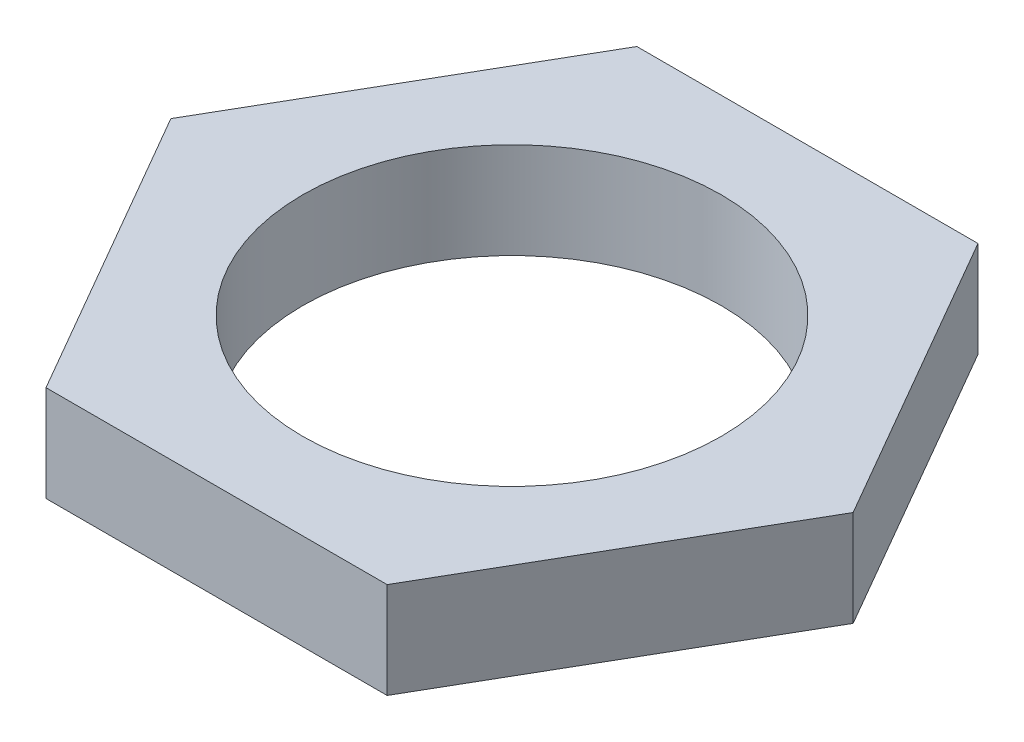
ISO-10303-21;
HEADER;
FILE_DESCRIPTION(('STEP AP214'),'2;1');
FILE_NAME('part.step','',(''),(''),'','','');
FILE_SCHEMA(('AUTOMOTIVE_DESIGN { 1 0 10303 214 1 1 1 1 }'));
ENDSEC;
DATA;
#1=APPLICATION_CONTEXT('core data for automotive mechanical design processes');
#2=APPLICATION_PROTOCOL_DEFINITION('international standard','automotive_design',2000,#1);
#3=PRODUCT_CONTEXT('',#1,'mechanical');
#4=PRODUCT('Part','Part','',(#3));
#5=PRODUCT_RELATED_PRODUCT_CATEGORY('part','',(#4));
#6=PRODUCT_DEFINITION_FORMATION('','',#4);
#7=PRODUCT_DEFINITION_CONTEXT('part definition',#1,'design');
#8=PRODUCT_DEFINITION('design','',#6,#7);
#9=PRODUCT_DEFINITION_SHAPE('','',#8);
#10=(LENGTH_UNIT() NAMED_UNIT(*) SI_UNIT(.MILLI.,.METRE.));
#11=(NAMED_UNIT(*) PLANE_ANGLE_UNIT() SI_UNIT($,.RADIAN.));
#12=(NAMED_UNIT(*) SI_UNIT($,.STERADIAN.) SOLID_ANGLE_UNIT());
#13=UNCERTAINTY_MEASURE_WITH_UNIT(LENGTH_MEASURE(1.E-05),#10,'distance_accuracy_value','');
#14=(GEOMETRIC_REPRESENTATION_CONTEXT(3) GLOBAL_UNCERTAINTY_ASSIGNED_CONTEXT((#13)) GLOBAL_UNIT_ASSIGNED_CONTEXT((#10,
#11,#12)) REPRESENTATION_CONTEXT('',''));
#15=CARTESIAN_POINT('',(0.,0.,0.));
#16=DIRECTION('',(0.,0.,1.));
#17=DIRECTION('',(1.,0.,0.));
#18=AXIS2_PLACEMENT_3D('',#15,#16,#17);
#19=CARTESIAN_POINT('',(0.,3.9,0.));
#20=DIRECTION('',(0.,1.,0.));
#21=DIRECTION('',(0.,0.,1.));
#22=AXIS2_PLACEMENT_3D('',#19,#20,#21);
#23=PLANE('',#22);
#24=DIRECTION('',(-0.5,0.,-0.866025403784439));
#25=VECTOR('',#24,1.);
#26=CARTESIAN_POINT('',(13.856406460551,3.9,0.));
#27=LINE('',#26,#25);
#28=CARTESIAN_POINT('',(13.856406460551,3.9,0.));
#29=VERTEX_POINT('',#28);
#30=CARTESIAN_POINT('',(6.92820323027551,3.9,-12.));
#31=VERTEX_POINT('',#30);
#32=EDGE_CURVE('E152',#29,#31,#27,.T.);
#33=ORIENTED_EDGE('',*,*,#32,.T.);
#34=DIRECTION('',(-1.,0.,0.));
#35=VECTOR('',#34,1.);
#36=CARTESIAN_POINT('',(6.92820323027551,3.9,-12.));
#37=LINE('',#36,#35);
#38=CARTESIAN_POINT('',(-6.9282032302755,3.9,-12.));
#39=VERTEX_POINT('',#38);
#40=EDGE_CURVE('E100',#31,#39,#37,.T.);
#41=ORIENTED_EDGE('',*,*,#40,.T.);
#42=DIRECTION('',(-0.5,0.,0.866025403784439));
#43=VECTOR('',#42,1.);
#44=CARTESIAN_POINT('',(-6.9282032302755,3.9,-12.));
#45=LINE('',#44,#43);
#46=CARTESIAN_POINT('',(-13.856406460551,3.9,0.));
#47=VERTEX_POINT('',#46);
#48=EDGE_CURVE('E113',#39,#47,#45,.T.);
#49=ORIENTED_EDGE('',*,*,#48,.T.);
#50=DIRECTION('',(0.5,0.,0.866025403784438));
#51=VECTOR('',#50,1.);
#52=CARTESIAN_POINT('',(-13.856406460551,3.9,0.));
#53=LINE('',#52,#51);
#54=CARTESIAN_POINT('',(-6.9282032302755,3.9,12.));
#55=VERTEX_POINT('',#54);
#56=EDGE_CURVE('E107',#47,#55,#53,.T.);
#57=ORIENTED_EDGE('',*,*,#56,.T.);
#58=DIRECTION('',(1.,0.,0.));
#59=VECTOR('',#58,1.);
#60=CARTESIAN_POINT('',(-6.9282032302755,3.9,12.));
#61=LINE('',#60,#59);
#62=CARTESIAN_POINT('',(6.92820323027551,3.9,12.));
#63=VERTEX_POINT('',#62);
#64=EDGE_CURVE('E111',#55,#63,#61,.T.);
#65=ORIENTED_EDGE('',*,*,#64,.T.);
#66=DIRECTION('',(0.5,0.,-0.866025403784439));
#67=VECTOR('',#66,1.);
#68=CARTESIAN_POINT('',(6.92820323027551,3.9,12.));
#69=LINE('',#68,#67);
#70=EDGE_CURVE('E63',#63,#29,#69,.T.);
#71=ORIENTED_EDGE('',*,*,#70,.T.);
#72=EDGE_LOOP('',(#33,#41,#49,#57,#65,#71));
#73=FACE_BOUND('',#72,.T.);
#74=CARTESIAN_POINT('',(0.,3.9,0.));
#75=DIRECTION('',(0.,1.,0.));
#76=DIRECTION('',(0.,0.,1.));
#77=AXIS2_PLACEMENT_3D('',#74,#75,#76);
#78=CIRCLE('',#77,8.5);
#79=CARTESIAN_POINT('',(0.,3.9,8.5));
#80=VERTEX_POINT('',#79);
#81=EDGE_CURVE('E140',#80,#80,#78,.T.);
#82=ORIENTED_EDGE('',*,*,#81,.F.);
#83=EDGE_LOOP('',(#82));
#84=FACE_BOUND('',#83,.T.);
#85=ADVANCED_FACE('F45',(#73,#84),#23,.T.);
#86=CARTESIAN_POINT('',(0.,0.,0.));
#87=DIRECTION('',(0.,1.,0.));
#88=DIRECTION('',(0.,0.,1.));
#89=AXIS2_PLACEMENT_3D('',#86,#87,#88);
#90=PLANE('',#89);
#91=DIRECTION('',(-0.5,0.,-0.866025403784439));
#92=VECTOR('',#91,1.);
#93=CARTESIAN_POINT('',(13.856406460551,0.,0.));
#94=LINE('',#93,#92);
#95=CARTESIAN_POINT('',(13.856406460551,0.,0.));
#96=VERTEX_POINT('',#95);
#97=CARTESIAN_POINT('',(6.92820323027551,0.,-12.));
#98=VERTEX_POINT('',#97);
#99=EDGE_CURVE('E135',#96,#98,#94,.T.);
#100=ORIENTED_EDGE('',*,*,#99,.F.);
#101=DIRECTION('',(0.5,0.,-0.866025403784439));
#102=VECTOR('',#101,1.);
#103=CARTESIAN_POINT('',(6.92820323027551,0.,12.));
#104=LINE('',#103,#102);
#105=CARTESIAN_POINT('',(6.92820323027551,0.,12.));
#106=VERTEX_POINT('',#105);
#107=EDGE_CURVE('E92',#106,#96,#104,.T.);
#108=ORIENTED_EDGE('',*,*,#107,.F.);
#109=DIRECTION('',(1.,0.,0.));
#110=VECTOR('',#109,1.);
#111=CARTESIAN_POINT('',(-6.9282032302755,0.,12.));
#112=LINE('',#111,#110);
#113=CARTESIAN_POINT('',(-6.9282032302755,0.,12.));
#114=VERTEX_POINT('',#113);
#115=EDGE_CURVE('E86',#114,#106,#112,.T.);
#116=ORIENTED_EDGE('',*,*,#115,.F.);
#117=DIRECTION('',(0.5,0.,0.866025403784438));
#118=VECTOR('',#117,1.);
#119=CARTESIAN_POINT('',(-13.856406460551,0.,0.));
#120=LINE('',#119,#118);
#121=CARTESIAN_POINT('',(-13.856406460551,0.,0.));
#122=VERTEX_POINT('',#121);
#123=EDGE_CURVE('E122',#122,#114,#120,.T.);
#124=ORIENTED_EDGE('',*,*,#123,.F.);
#125=DIRECTION('',(-0.5,0.,0.866025403784439));
#126=VECTOR('',#125,1.);
#127=CARTESIAN_POINT('',(-6.9282032302755,0.,-12.));
#128=LINE('',#127,#126);
#129=CARTESIAN_POINT('',(-6.9282032302755,0.,-12.));
#130=VERTEX_POINT('',#129);
#131=EDGE_CURVE('E143',#130,#122,#128,.T.);
#132=ORIENTED_EDGE('',*,*,#131,.F.);
#133=DIRECTION('',(-1.,0.,0.));
#134=VECTOR('',#133,1.);
#135=CARTESIAN_POINT('',(6.92820323027551,0.,-12.));
#136=LINE('',#135,#134);
#137=EDGE_CURVE('E139',#98,#130,#136,.T.);
#138=ORIENTED_EDGE('',*,*,#137,.F.);
#139=EDGE_LOOP('',(#100,#108,#116,#124,#132,#138));
#140=FACE_BOUND('',#139,.T.);
#141=CARTESIAN_POINT('',(0.,0.,0.));
#142=DIRECTION('',(0.,1.,0.));
#143=DIRECTION('',(0.,0.,1.));
#144=AXIS2_PLACEMENT_3D('',#141,#142,#143);
#145=CIRCLE('',#144,8.5);
#146=CARTESIAN_POINT('',(0.,0.,8.5));
#147=VERTEX_POINT('',#146);
#148=EDGE_CURVE('E249',#147,#147,#145,.T.);
#149=ORIENTED_EDGE('',*,*,#148,.T.);
#150=EDGE_LOOP('',(#149));
#151=FACE_BOUND('',#150,.T.);
#152=ADVANCED_FACE('F165',(#140,#151),#90,.F.);
#153=CARTESIAN_POINT('',(13.856406460551,3.9,0.));
#154=DIRECTION('',(-0.866025403784439,0.,0.5));
#155=DIRECTION('',(0.5,0.,0.866025403784439));
#156=AXIS2_PLACEMENT_3D('',#153,#154,#155);
#157=PLANE('',#156);
#158=ORIENTED_EDGE('',*,*,#99,.T.);
#159=DIRECTION('',(0.,-1.,0.));
#160=VECTOR('',#159,1.);
#161=CARTESIAN_POINT('',(6.92820323027551,3.9,-12.));
#162=LINE('',#161,#160);
#163=EDGE_CURVE('E11',#31,#98,#162,.T.);
#164=ORIENTED_EDGE('',*,*,#163,.F.);
#165=ORIENTED_EDGE('',*,*,#32,.F.);
#166=DIRECTION('',(0.,-1.,0.));
#167=VECTOR('',#166,1.);
#168=CARTESIAN_POINT('',(13.856406460551,3.9,0.));
#169=LINE('',#168,#167);
#170=EDGE_CURVE('E131',#29,#96,#169,.T.);
#171=ORIENTED_EDGE('',*,*,#170,.T.);
#172=EDGE_LOOP('',(#158,#164,#165,#171));
#173=FACE_BOUND('',#172,.T.);
#174=ADVANCED_FACE('F47',(#173),#157,.F.);
#175=CARTESIAN_POINT('',(6.92820323027551,3.9,-12.));
#176=DIRECTION('',(0.,0.,1.));
#177=DIRECTION('',(1.,0.,0.));
#178=AXIS2_PLACEMENT_3D('',#175,#176,#177);
#179=PLANE('',#178);
#180=ORIENTED_EDGE('',*,*,#137,.T.);
#181=DIRECTION('',(0.,-1.,0.));
#182=VECTOR('',#181,1.);
#183=CARTESIAN_POINT('',(-6.9282032302755,3.9,-12.));
#184=LINE('',#183,#182);
#185=EDGE_CURVE('E55',#39,#130,#184,.T.);
#186=ORIENTED_EDGE('',*,*,#185,.F.);
#187=ORIENTED_EDGE('',*,*,#40,.F.);
#188=ORIENTED_EDGE('',*,*,#163,.T.);
#189=EDGE_LOOP('',(#180,#186,#187,#188));
#190=FACE_BOUND('',#189,.T.);
#191=ADVANCED_FACE('F190',(#190),#179,.F.);
#192=CARTESIAN_POINT('',(-6.9282032302755,3.9,-12.));
#193=DIRECTION('',(0.866025403784439,0.,0.5));
#194=DIRECTION('',(0.5,0.,-0.866025403784439));
#195=AXIS2_PLACEMENT_3D('',#192,#193,#194);
#196=PLANE('',#195);
#197=ORIENTED_EDGE('',*,*,#131,.T.);
#198=DIRECTION('',(0.,-1.,0.));
#199=VECTOR('',#198,1.);
#200=CARTESIAN_POINT('',(-13.856406460551,3.9,0.));
#201=LINE('',#200,#199);
#202=EDGE_CURVE('E124',#47,#122,#201,.T.);
#203=ORIENTED_EDGE('',*,*,#202,.F.);
#204=ORIENTED_EDGE('',*,*,#48,.F.);
#205=ORIENTED_EDGE('',*,*,#185,.T.);
#206=EDGE_LOOP('',(#197,#203,#204,#205));
#207=FACE_BOUND('',#206,.T.);
#208=ADVANCED_FACE('F162',(#207),#196,.F.);
#209=CARTESIAN_POINT('',(-13.856406460551,3.9,0.));
#210=DIRECTION('',(0.866025403784439,0.,-0.5));
#211=DIRECTION('',(-0.5,0.,-0.866025403784439));
#212=AXIS2_PLACEMENT_3D('',#209,#210,#211);
#213=PLANE('',#212);
#214=ORIENTED_EDGE('',*,*,#123,.T.);
#215=DIRECTION('',(0.,-1.,0.));
#216=VECTOR('',#215,1.);
#217=CARTESIAN_POINT('',(-6.9282032302755,3.9,12.));
#218=LINE('',#217,#216);
#219=EDGE_CURVE('E119',#55,#114,#218,.T.);
#220=ORIENTED_EDGE('',*,*,#219,.F.);
#221=ORIENTED_EDGE('',*,*,#56,.F.);
#222=ORIENTED_EDGE('',*,*,#202,.T.);
#223=EDGE_LOOP('',(#214,#220,#221,#222));
#224=FACE_BOUND('',#223,.T.);
#225=ADVANCED_FACE('F120',(#224),#213,.F.);
#226=CARTESIAN_POINT('',(-6.9282032302755,3.9,12.));
#227=DIRECTION('',(0.,0.,-1.));
#228=DIRECTION('',(-1.,0.,0.));
#229=AXIS2_PLACEMENT_3D('',#226,#227,#228);
#230=PLANE('',#229);
#231=ORIENTED_EDGE('',*,*,#115,.T.);
#232=DIRECTION('',(0.,-1.,0.));
#233=VECTOR('',#232,1.);
#234=CARTESIAN_POINT('',(6.92820323027551,3.9,12.));
#235=LINE('',#234,#233);
#236=EDGE_CURVE('E125',#63,#106,#235,.T.);
#237=ORIENTED_EDGE('',*,*,#236,.F.);
#238=ORIENTED_EDGE('',*,*,#64,.F.);
#239=ORIENTED_EDGE('',*,*,#219,.T.);
#240=EDGE_LOOP('',(#231,#237,#238,#239));
#241=FACE_BOUND('',#240,.T.);
#242=ADVANCED_FACE('F127',(#241),#230,.F.);
#243=CARTESIAN_POINT('',(6.92820323027551,3.9,12.));
#244=DIRECTION('',(-0.866025403784439,0.,-0.5));
#245=DIRECTION('',(-0.5,0.,0.866025403784439));
#246=AXIS2_PLACEMENT_3D('',#243,#244,#245);
#247=PLANE('',#246);
#248=ORIENTED_EDGE('',*,*,#107,.T.);
#249=ORIENTED_EDGE('',*,*,#170,.F.);
#250=ORIENTED_EDGE('',*,*,#70,.F.);
#251=ORIENTED_EDGE('',*,*,#236,.T.);
#252=EDGE_LOOP('',(#248,#249,#250,#251));
#253=FACE_BOUND('',#252,.T.);
#254=ADVANCED_FACE('F170',(#253),#247,.F.);
#255=CARTESIAN_POINT('',(0.,3.9,0.));
#256=DIRECTION('',(0.,-1.,0.));
#257=DIRECTION('',(0.,0.,-1.));
#258=AXIS2_PLACEMENT_3D('',#255,#256,#257);
#259=CYLINDRICAL_SURFACE('',#258,8.5);
#260=ORIENTED_EDGE('',*,*,#81,.T.);
#261=EDGE_LOOP('',(#260));
#262=FACE_BOUND('',#261,.T.);
#263=ORIENTED_EDGE('',*,*,#148,.F.);
#264=EDGE_LOOP('',(#263));
#265=FACE_BOUND('',#264,.T.);
#266=ADVANCED_FACE('F172',(#262,#265),#259,.F.);
#267=CLOSED_SHELL('',(#85,#152,#174,#191,#208,#225,#242,#254,#266));
#268=MANIFOLD_SOLID_BREP('B2',#267);
#269=ADVANCED_BREP_SHAPE_REPRESENTATION('',(#18,#268),#14);
#270=SHAPE_DEFINITION_REPRESENTATION(#9,#269);
ENDSEC;
END-ISO-10303-21;
